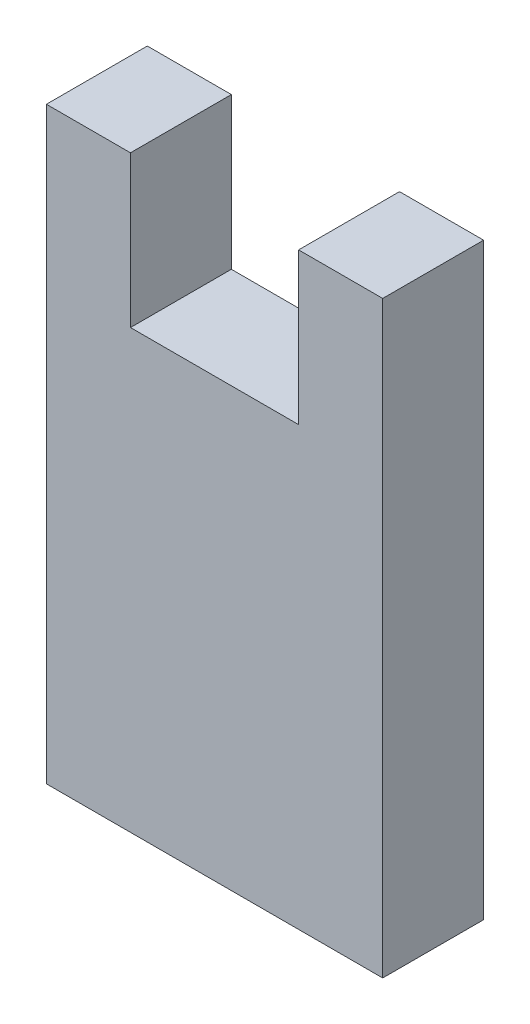
ISO-10303-21;
HEADER;
FILE_DESCRIPTION(('STEP AP214'),'2;1');
FILE_NAME('part.step','',(''),(''),'','','');
FILE_SCHEMA(('AUTOMOTIVE_DESIGN { 1 0 10303 214 1 1 1 1 }'));
ENDSEC;
DATA;
#1=APPLICATION_CONTEXT('core data for automotive mechanical design processes');
#2=APPLICATION_PROTOCOL_DEFINITION('international standard','automotive_design',2000,#1);
#3=PRODUCT_CONTEXT('',#1,'mechanical');
#4=PRODUCT('Part','Part','',(#3));
#5=PRODUCT_RELATED_PRODUCT_CATEGORY('part','',(#4));
#6=PRODUCT_DEFINITION_FORMATION('','',#4);
#7=PRODUCT_DEFINITION_CONTEXT('part definition',#1,'design');
#8=PRODUCT_DEFINITION('design','',#6,#7);
#9=PRODUCT_DEFINITION_SHAPE('','',#8);
#10=(LENGTH_UNIT() NAMED_UNIT(*) SI_UNIT(.MILLI.,.METRE.));
#11=(NAMED_UNIT(*) PLANE_ANGLE_UNIT() SI_UNIT($,.RADIAN.));
#12=(NAMED_UNIT(*) SI_UNIT($,.STERADIAN.) SOLID_ANGLE_UNIT());
#13=UNCERTAINTY_MEASURE_WITH_UNIT(LENGTH_MEASURE(1.E-05),#10,'distance_accuracy_value','');
#14=(GEOMETRIC_REPRESENTATION_CONTEXT(3) GLOBAL_UNCERTAINTY_ASSIGNED_CONTEXT((#13)) GLOBAL_UNIT_ASSIGNED_CONTEXT((#10,
#11,#12)) REPRESENTATION_CONTEXT('',''));
#15=CARTESIAN_POINT('',(0.,0.,0.));
#16=DIRECTION('',(0.,0.,1.));
#17=DIRECTION('',(1.,0.,0.));
#18=AXIS2_PLACEMENT_3D('',#15,#16,#17);
#19=CARTESIAN_POINT('',(-20.,35.,12.));
#20=DIRECTION('',(0.,-1.,0.));
#21=DIRECTION('',(0.,0.,-1.));
#22=AXIS2_PLACEMENT_3D('',#19,#20,#21);
#23=PLANE('',#22);
#24=DIRECTION('',(-1.,0.,0.));
#25=VECTOR('',#24,1.);
#26=CARTESIAN_POINT('',(-20.,35.,12.));
#27=LINE('',#26,#25);
#28=CARTESIAN_POINT('',(-10.,35.,12.));
#29=VERTEX_POINT('',#28);
#30=CARTESIAN_POINT('',(-20.,35.,12.));
#31=VERTEX_POINT('',#30);
#32=EDGE_CURVE('E169',#29,#31,#27,.T.);
#33=ORIENTED_EDGE('',*,*,#32,.F.);
#34=DIRECTION('',(0.,0.,1.));
#35=VECTOR('',#34,1.);
#36=CARTESIAN_POINT('',(-10.,35.,0.));
#37=LINE('',#36,#35);
#38=CARTESIAN_POINT('',(-10.,35.,0.));
#39=VERTEX_POINT('',#38);
#40=EDGE_CURVE('E157',#39,#29,#37,.T.);
#41=ORIENTED_EDGE('',*,*,#40,.F.);
#42=DIRECTION('',(-1.,0.,0.));
#43=VECTOR('',#42,1.);
#44=CARTESIAN_POINT('',(-20.,35.,0.));
#45=LINE('',#44,#43);
#46=CARTESIAN_POINT('',(-20.,35.,0.));
#47=VERTEX_POINT('',#46);
#48=EDGE_CURVE('E143',#39,#47,#45,.T.);
#49=ORIENTED_EDGE('',*,*,#48,.T.);
#50=DIRECTION('',(0.,0.,-1.));
#51=VECTOR('',#50,1.);
#52=CARTESIAN_POINT('',(-20.,35.,12.));
#53=LINE('',#52,#51);
#54=EDGE_CURVE('E54',#31,#47,#53,.T.);
#55=ORIENTED_EDGE('',*,*,#54,.F.);
#56=EDGE_LOOP('',(#33,#41,#49,#55));
#57=FACE_BOUND('',#56,.T.);
#58=ADVANCED_FACE('F45',(#57),#23,.F.);
#59=CARTESIAN_POINT('',(20.,-35.,12.));
#60=DIRECTION('',(-1.,0.,0.));
#61=DIRECTION('',(0.,0.,1.));
#62=AXIS2_PLACEMENT_3D('',#59,#60,#61);
#63=PLANE('',#62);
#64=DIRECTION('',(0.,1.,0.));
#65=VECTOR('',#64,1.);
#66=CARTESIAN_POINT('',(20.,-35.,0.));
#67=LINE('',#66,#65);
#68=CARTESIAN_POINT('',(20.,-35.,0.));
#69=VERTEX_POINT('',#68);
#70=CARTESIAN_POINT('',(20.,35.,0.));
#71=VERTEX_POINT('',#70);
#72=EDGE_CURVE('E160',#69,#71,#67,.T.);
#73=ORIENTED_EDGE('',*,*,#72,.T.);
#74=DIRECTION('',(0.,0.,-1.));
#75=VECTOR('',#74,1.);
#76=CARTESIAN_POINT('',(20.,35.,12.));
#77=LINE('',#76,#75);
#78=CARTESIAN_POINT('',(20.,35.,12.));
#79=VERTEX_POINT('',#78);
#80=EDGE_CURVE('E11',#79,#71,#77,.T.);
#81=ORIENTED_EDGE('',*,*,#80,.F.);
#82=DIRECTION('',(0.,1.,0.));
#83=VECTOR('',#82,1.);
#84=CARTESIAN_POINT('',(20.,-35.,12.));
#85=LINE('',#84,#83);
#86=CARTESIAN_POINT('',(20.,-35.,12.));
#87=VERTEX_POINT('',#86);
#88=EDGE_CURVE('E166',#87,#79,#85,.T.);
#89=ORIENTED_EDGE('',*,*,#88,.F.);
#90=DIRECTION('',(0.,0.,-1.));
#91=VECTOR('',#90,1.);
#92=CARTESIAN_POINT('',(20.,-35.,12.));
#93=LINE('',#92,#91);
#94=EDGE_CURVE('E177',#87,#69,#93,.T.);
#95=ORIENTED_EDGE('',*,*,#94,.T.);
#96=EDGE_LOOP('',(#73,#81,#89,#95));
#97=FACE_BOUND('',#96,.T.);
#98=ADVANCED_FACE('F47',(#97),#63,.F.);
#99=CARTESIAN_POINT('',(9.99999999999999,35.,0.));
#100=VERTEX_POINT('',#99);
#101=EDGE_CURVE('E181',#71,#100,#45,.T.);
#102=ORIENTED_EDGE('',*,*,#101,.T.);
#103=DIRECTION('',(0.,0.,1.));
#104=VECTOR('',#103,1.);
#105=CARTESIAN_POINT('',(9.99999999999999,35.,0.));
#106=LINE('',#105,#104);
#107=CARTESIAN_POINT('',(9.99999999999999,35.,12.));
#108=VERTEX_POINT('',#107);
#109=EDGE_CURVE('E161',#100,#108,#106,.T.);
#110=ORIENTED_EDGE('',*,*,#109,.T.);
#111=EDGE_CURVE('E98',#79,#108,#27,.T.);
#112=ORIENTED_EDGE('',*,*,#111,.F.);
#113=ORIENTED_EDGE('',*,*,#80,.T.);
#114=EDGE_LOOP('',(#102,#110,#112,#113));
#115=FACE_BOUND('',#114,.T.);
#116=ADVANCED_FACE('F217',(#115),#23,.F.);
#117=CARTESIAN_POINT('',(-20.,-35.,12.));
#118=DIRECTION('',(1.,0.,0.));
#119=DIRECTION('',(0.,0.,-1.));
#120=AXIS2_PLACEMENT_3D('',#117,#118,#119);
#121=PLANE('',#120);
#122=DIRECTION('',(0.,-1.,0.));
#123=VECTOR('',#122,1.);
#124=CARTESIAN_POINT('',(-20.,-35.,0.));
#125=LINE('',#124,#123);
#126=CARTESIAN_POINT('',(-20.,-35.,0.));
#127=VERTEX_POINT('',#126);
#128=EDGE_CURVE('E185',#47,#127,#125,.T.);
#129=ORIENTED_EDGE('',*,*,#128,.T.);
#130=DIRECTION('',(0.,0.,-1.));
#131=VECTOR('',#130,1.);
#132=CARTESIAN_POINT('',(-20.,-35.,12.));
#133=LINE('',#132,#131);
#134=CARTESIAN_POINT('',(-20.,-35.,12.));
#135=VERTEX_POINT('',#134);
#136=EDGE_CURVE('E192',#135,#127,#133,.T.);
#137=ORIENTED_EDGE('',*,*,#136,.F.);
#138=DIRECTION('',(0.,-1.,0.));
#139=VECTOR('',#138,1.);
#140=CARTESIAN_POINT('',(-20.,-35.,12.));
#141=LINE('',#140,#139);
#142=EDGE_CURVE('E172',#31,#135,#141,.T.);
#143=ORIENTED_EDGE('',*,*,#142,.F.);
#144=ORIENTED_EDGE('',*,*,#54,.T.);
#145=EDGE_LOOP('',(#129,#137,#143,#144));
#146=FACE_BOUND('',#145,.T.);
#147=ADVANCED_FACE('F199',(#146),#121,.F.);
#148=CARTESIAN_POINT('',(-20.,-35.,12.));
#149=DIRECTION('',(0.,1.,0.));
#150=DIRECTION('',(0.,0.,1.));
#151=AXIS2_PLACEMENT_3D('',#148,#149,#150);
#152=PLANE('',#151);
#153=DIRECTION('',(1.,0.,0.));
#154=VECTOR('',#153,1.);
#155=CARTESIAN_POINT('',(-20.,-35.,0.));
#156=LINE('',#155,#154);
#157=EDGE_CURVE('E91',#127,#69,#156,.T.);
#158=ORIENTED_EDGE('',*,*,#157,.T.);
#159=ORIENTED_EDGE('',*,*,#94,.F.);
#160=DIRECTION('',(1.,0.,0.));
#161=VECTOR('',#160,1.);
#162=CARTESIAN_POINT('',(-20.,-35.,12.));
#163=LINE('',#162,#161);
#164=EDGE_CURVE('E70',#135,#87,#163,.T.);
#165=ORIENTED_EDGE('',*,*,#164,.F.);
#166=ORIENTED_EDGE('',*,*,#136,.T.);
#167=EDGE_LOOP('',(#158,#159,#165,#166));
#168=FACE_BOUND('',#167,.T.);
#169=ADVANCED_FACE('F207',(#168),#152,.F.);
#170=CARTESIAN_POINT('',(0.,0.,12.));
#171=DIRECTION('',(0.,0.,-1.));
#172=DIRECTION('',(-1.,0.,0.));
#173=AXIS2_PLACEMENT_3D('',#170,#171,#172);
#174=PLANE('',#173);
#175=DIRECTION('',(1.,0.,0.));
#176=VECTOR('',#175,1.);
#177=CARTESIAN_POINT('',(-10.,17.,12.));
#178=LINE('',#177,#176);
#179=CARTESIAN_POINT('',(-10.,17.,12.));
#180=VERTEX_POINT('',#179);
#181=CARTESIAN_POINT('',(10.,17.,12.));
#182=VERTEX_POINT('',#181);
#183=EDGE_CURVE('E148',#180,#182,#178,.T.);
#184=ORIENTED_EDGE('',*,*,#183,.F.);
#185=DIRECTION('',(0.,-1.,0.));
#186=VECTOR('',#185,1.);
#187=CARTESIAN_POINT('',(-10.,35.,12.));
#188=LINE('',#187,#186);
#189=EDGE_CURVE('E127',#29,#180,#188,.T.);
#190=ORIENTED_EDGE('',*,*,#189,.F.);
#191=ORIENTED_EDGE('',*,*,#32,.T.);
#192=ORIENTED_EDGE('',*,*,#142,.T.);
#193=ORIENTED_EDGE('',*,*,#164,.T.);
#194=ORIENTED_EDGE('',*,*,#88,.T.);
#195=ORIENTED_EDGE('',*,*,#111,.T.);
#196=DIRECTION('',(0.,1.,0.));
#197=VECTOR('',#196,1.);
#198=CARTESIAN_POINT('',(9.99999999999999,35.,12.));
#199=LINE('',#198,#197);
#200=EDGE_CURVE('E145',#182,#108,#199,.T.);
#201=ORIENTED_EDGE('',*,*,#200,.F.);
#202=EDGE_LOOP('',(#184,#190,#191,#192,#193,#194,#195,#201));
#203=FACE_BOUND('',#202,.T.);
#204=ADVANCED_FACE('F209',(#203),#174,.F.);
#205=CARTESIAN_POINT('',(0.,0.,0.));
#206=DIRECTION('',(0.,0.,-1.));
#207=DIRECTION('',(-1.,0.,0.));
#208=AXIS2_PLACEMENT_3D('',#205,#206,#207);
#209=PLANE('',#208);
#210=DIRECTION('',(0.,-1.,0.));
#211=VECTOR('',#210,1.);
#212=CARTESIAN_POINT('',(-10.,35.,0.));
#213=LINE('',#212,#211);
#214=CARTESIAN_POINT('',(-10.,17.,0.));
#215=VERTEX_POINT('',#214);
#216=EDGE_CURVE('E124',#39,#215,#213,.T.);
#217=ORIENTED_EDGE('',*,*,#216,.T.);
#218=DIRECTION('',(1.,0.,0.));
#219=VECTOR('',#218,1.);
#220=CARTESIAN_POINT('',(-10.,17.,0.));
#221=LINE('',#220,#219);
#222=CARTESIAN_POINT('',(10.,17.,0.));
#223=VERTEX_POINT('',#222);
#224=EDGE_CURVE('E135',#215,#223,#221,.T.);
#225=ORIENTED_EDGE('',*,*,#224,.T.);
#226=DIRECTION('',(0.,1.,0.));
#227=VECTOR('',#226,1.);
#228=CARTESIAN_POINT('',(9.99999999999999,35.,0.));
#229=LINE('',#228,#227);
#230=EDGE_CURVE('E61',#223,#100,#229,.T.);
#231=ORIENTED_EDGE('',*,*,#230,.T.);
#232=ORIENTED_EDGE('',*,*,#101,.F.);
#233=ORIENTED_EDGE('',*,*,#72,.F.);
#234=ORIENTED_EDGE('',*,*,#157,.F.);
#235=ORIENTED_EDGE('',*,*,#128,.F.);
#236=ORIENTED_EDGE('',*,*,#48,.F.);
#237=EDGE_LOOP('',(#217,#225,#231,#232,#233,#234,#235,#236));
#238=FACE_BOUND('',#237,.T.);
#239=ADVANCED_FACE('F141',(#238),#209,.T.);
#240=CARTESIAN_POINT('',(-10.,35.,0.));
#241=DIRECTION('',(-1.,0.,0.));
#242=DIRECTION('',(0.,-1.,0.));
#243=AXIS2_PLACEMENT_3D('',#240,#241,#242);
#244=PLANE('',#243);
#245=ORIENTED_EDGE('',*,*,#189,.T.);
#246=DIRECTION('',(0.,0.,1.));
#247=VECTOR('',#246,1.);
#248=CARTESIAN_POINT('',(-10.,17.,0.));
#249=LINE('',#248,#247);
#250=EDGE_CURVE('E120',#215,#180,#249,.T.);
#251=ORIENTED_EDGE('',*,*,#250,.F.);
#252=ORIENTED_EDGE('',*,*,#216,.F.);
#253=ORIENTED_EDGE('',*,*,#40,.T.);
#254=EDGE_LOOP('',(#245,#251,#252,#253));
#255=FACE_BOUND('',#254,.T.);
#256=ADVANCED_FACE('F122',(#255),#244,.F.);
#257=CARTESIAN_POINT('',(9.99999999999999,35.,0.));
#258=DIRECTION('',(1.,0.,0.));
#259=DIRECTION('',(0.,1.,0.));
#260=AXIS2_PLACEMENT_3D('',#257,#258,#259);
#261=PLANE('',#260);
#262=ORIENTED_EDGE('',*,*,#200,.T.);
#263=ORIENTED_EDGE('',*,*,#109,.F.);
#264=ORIENTED_EDGE('',*,*,#230,.F.);
#265=DIRECTION('',(0.,0.,1.));
#266=VECTOR('',#265,1.);
#267=CARTESIAN_POINT('',(10.,17.,0.));
#268=LINE('',#267,#266);
#269=EDGE_CURVE('E132',#223,#182,#268,.T.);
#270=ORIENTED_EDGE('',*,*,#269,.T.);
#271=EDGE_LOOP('',(#262,#263,#264,#270));
#272=FACE_BOUND('',#271,.T.);
#273=ADVANCED_FACE('F227',(#272),#261,.F.);
#274=CARTESIAN_POINT('',(-10.,17.,0.));
#275=DIRECTION('',(0.,-1.,0.));
#276=DIRECTION('',(0.,0.,-1.));
#277=AXIS2_PLACEMENT_3D('',#274,#275,#276);
#278=PLANE('',#277);
#279=ORIENTED_EDGE('',*,*,#183,.T.);
#280=ORIENTED_EDGE('',*,*,#269,.F.);
#281=ORIENTED_EDGE('',*,*,#224,.F.);
#282=ORIENTED_EDGE('',*,*,#250,.T.);
#283=EDGE_LOOP('',(#279,#280,#281,#282));
#284=FACE_BOUND('',#283,.T.);
#285=ADVANCED_FACE('F136',(#284),#278,.F.);
#286=CLOSED_SHELL('',(#58,#98,#116,#147,#169,#204,#239,#256,#273,#285));
#287=MANIFOLD_SOLID_BREP('B2',#286);
#288=ADVANCED_BREP_SHAPE_REPRESENTATION('',(#18,#287),#14);
#289=SHAPE_DEFINITION_REPRESENTATION(#9,#288);
ENDSEC;
END-ISO-10303-21;
